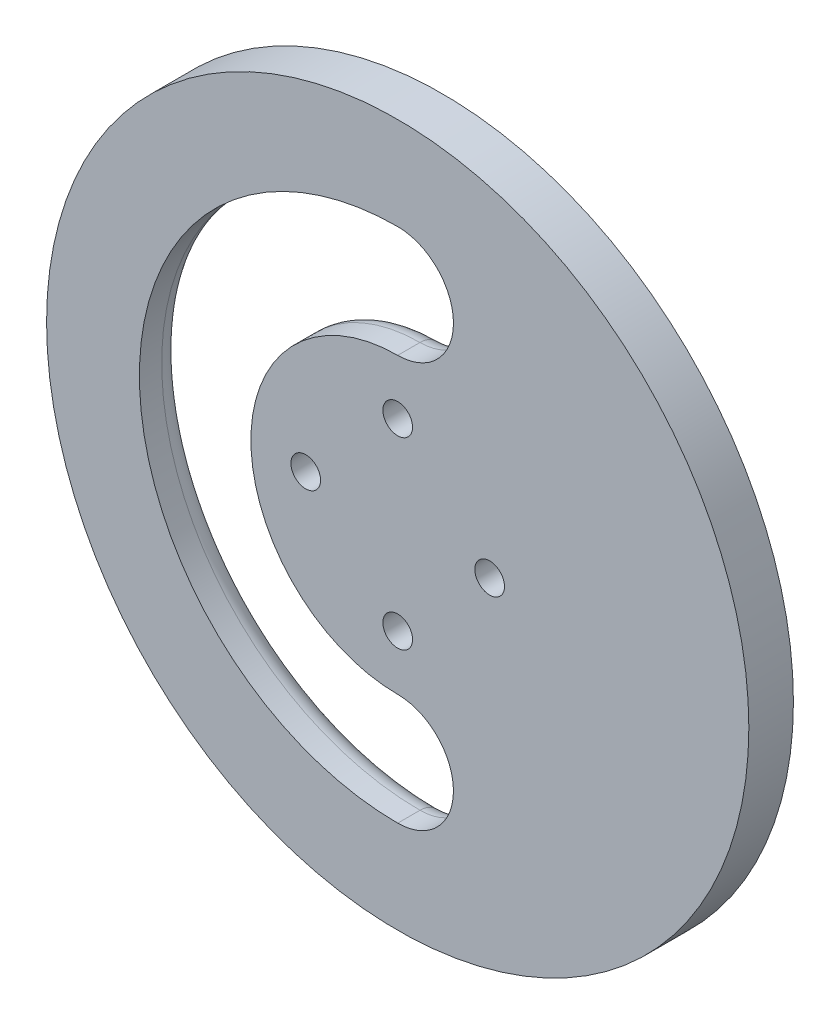
ISO-10303-21;
HEADER;
FILE_DESCRIPTION(('STEP AP214'),'2;1');
FILE_NAME('part.step','',(''),(''),'','','');
FILE_SCHEMA(('AUTOMOTIVE_DESIGN { 1 0 10303 214 1 1 1 1 }'));
ENDSEC;
DATA;
#1=APPLICATION_CONTEXT('core data for automotive mechanical design processes');
#2=APPLICATION_PROTOCOL_DEFINITION('international standard','automotive_design',2000,#1);
#3=PRODUCT_CONTEXT('',#1,'mechanical');
#4=PRODUCT('Part','Part','',(#3));
#5=PRODUCT_RELATED_PRODUCT_CATEGORY('part','',(#4));
#6=PRODUCT_DEFINITION_FORMATION('','',#4);
#7=PRODUCT_DEFINITION_CONTEXT('part definition',#1,'design');
#8=PRODUCT_DEFINITION('design','',#6,#7);
#9=PRODUCT_DEFINITION_SHAPE('','',#8);
#10=(LENGTH_UNIT() NAMED_UNIT(*) SI_UNIT(.MILLI.,.METRE.));
#11=(NAMED_UNIT(*) PLANE_ANGLE_UNIT() SI_UNIT($,.RADIAN.));
#12=(NAMED_UNIT(*) SI_UNIT($,.STERADIAN.) SOLID_ANGLE_UNIT());
#13=UNCERTAINTY_MEASURE_WITH_UNIT(LENGTH_MEASURE(1.E-05),#10,'distance_accuracy_value','');
#14=(GEOMETRIC_REPRESENTATION_CONTEXT(3) GLOBAL_UNCERTAINTY_ASSIGNED_CONTEXT((#13)) GLOBAL_UNIT_ASSIGNED_CONTEXT((#10,
#11,#12)) REPRESENTATION_CONTEXT('',''));
#15=CARTESIAN_POINT('',(0.,0.,0.));
#16=DIRECTION('',(0.,0.,1.));
#17=DIRECTION('',(1.,0.,0.));
#18=AXIS2_PLACEMENT_3D('',#15,#16,#17);
#19=CARTESIAN_POINT('',(0.,0.,4.));
#20=DIRECTION('',(0.,0.,-1.));
#21=DIRECTION('',(-1.,0.,0.));
#22=AXIS2_PLACEMENT_3D('',#19,#20,#21);
#23=CYLINDRICAL_SURFACE('',#22,31.5);
#24=CARTESIAN_POINT('',(0.,0.,4.));
#25=DIRECTION('',(0.,0.,1.));
#26=DIRECTION('',(1.,0.,0.));
#27=AXIS2_PLACEMENT_3D('',#24,#25,#26);
#28=CIRCLE('',#27,31.5);
#29=CARTESIAN_POINT('',(31.5,0.,4.));
#30=VERTEX_POINT('',#29);
#31=EDGE_CURVE('E207',#30,#30,#28,.T.);
#32=ORIENTED_EDGE('',*,*,#31,.F.);
#33=EDGE_LOOP('',(#32));
#34=FACE_BOUND('',#33,.T.);
#35=CARTESIAN_POINT('',(0.,0.,0.));
#36=DIRECTION('',(0.,0.,1.));
#37=DIRECTION('',(1.,0.,0.));
#38=AXIS2_PLACEMENT_3D('',#35,#36,#37);
#39=CIRCLE('',#38,31.5);
#40=CARTESIAN_POINT('',(31.5,0.,0.));
#41=VERTEX_POINT('',#40);
#42=EDGE_CURVE('E186',#41,#41,#39,.T.);
#43=ORIENTED_EDGE('',*,*,#42,.T.);
#44=EDGE_LOOP('',(#43));
#45=FACE_BOUND('',#44,.T.);
#46=ADVANCED_FACE('F37',(#34,#45),#23,.T.);
#47=CARTESIAN_POINT('',(0.,0.,4.));
#48=DIRECTION('',(0.,0.,1.));
#49=DIRECTION('',(1.,0.,0.));
#50=AXIS2_PLACEMENT_3D('',#47,#48,#49);
#51=PLANE('',#50);
#52=CARTESIAN_POINT('',(0.,0.,4.));
#53=DIRECTION('',(0.,0.,1.));
#54=DIRECTION('',(1.,0.,0.));
#55=AXIS2_PLACEMENT_3D('',#52,#53,#54);
#56=CIRCLE('',#55,23.1723185156235);
#57=CARTESIAN_POINT('',(0.,23.1723185156235,4.));
#58=VERTEX_POINT('',#57);
#59=CARTESIAN_POINT('',(0.,-23.1723185156235,4.));
#60=VERTEX_POINT('',#59);
#61=EDGE_CURVE('E128',#58,#60,#56,.T.);
#62=ORIENTED_EDGE('',*,*,#61,.F.);
#63=CARTESIAN_POINT('',(0.,18.1711592578118,4.));
#64=DIRECTION('',(0.,0.,1.));
#65=DIRECTION('',(1.,0.,0.));
#66=AXIS2_PLACEMENT_3D('',#63,#64,#65);
#67=CIRCLE('',#66,5.00115925781177);
#68=CARTESIAN_POINT('',(0.,13.17,4.));
#69=VERTEX_POINT('',#68);
#70=EDGE_CURVE('E133',#69,#58,#67,.T.);
#71=ORIENTED_EDGE('',*,*,#70,.F.);
#72=CARTESIAN_POINT('',(0.,0.,4.));
#73=DIRECTION('',(0.,0.,-1.));
#74=DIRECTION('',(1.,0.,0.));
#75=AXIS2_PLACEMENT_3D('',#72,#73,#74);
#76=CIRCLE('',#75,13.17);
#77=CARTESIAN_POINT('',(0.,-13.17,4.));
#78=VERTEX_POINT('',#77);
#79=EDGE_CURVE('E117',#78,#69,#76,.T.);
#80=ORIENTED_EDGE('',*,*,#79,.F.);
#81=CARTESIAN_POINT('',(0.,-18.1711592578118,4.));
#82=DIRECTION('',(0.,0.,1.));
#83=DIRECTION('',(1.,0.,0.));
#84=AXIS2_PLACEMENT_3D('',#81,#82,#83);
#85=CIRCLE('',#84,5.00115925781177);
#86=EDGE_CURVE('E123',#60,#78,#85,.T.);
#87=ORIENTED_EDGE('',*,*,#86,.F.);
#88=EDGE_LOOP('',(#62,#71,#80,#87));
#89=FACE_BOUND('',#88,.T.);
#90=CARTESIAN_POINT('',(0.,8.25,4.));
#91=DIRECTION('',(0.,0.,-1.));
#92=DIRECTION('',(-1.,0.,0.));
#93=AXIS2_PLACEMENT_3D('',#90,#91,#92);
#94=CIRCLE('',#93,1.33);
#95=CARTESIAN_POINT('',(-1.33,8.25,4.));
#96=VERTEX_POINT('',#95);
#97=EDGE_CURVE('E183',#96,#96,#94,.T.);
#98=ORIENTED_EDGE('',*,*,#97,.T.);
#99=EDGE_LOOP('',(#98));
#100=FACE_BOUND('',#99,.T.);
#101=CARTESIAN_POINT('',(-8.25000000000023,2.32963602386888E-13,4.));
#102=DIRECTION('',(0.,0.,-1.));
#103=DIRECTION('',(-1.,0.,0.));
#104=AXIS2_PLACEMENT_3D('',#101,#102,#103);
#105=CIRCLE('',#104,1.33000000000018);
#106=CARTESIAN_POINT('',(-9.58000000000042,2.32963602386888E-13,4.));
#107=VERTEX_POINT('',#106);
#108=EDGE_CURVE('E190',#107,#107,#105,.T.);
#109=ORIENTED_EDGE('',*,*,#108,.T.);
#110=EDGE_LOOP('',(#109));
#111=FACE_BOUND('',#110,.T.);
#112=CARTESIAN_POINT('',(-4.67285447674905E-13,-8.25,4.));
#113=DIRECTION('',(0.,0.,-1.));
#114=DIRECTION('',(-1.,0.,0.));
#115=AXIS2_PLACEMENT_3D('',#112,#113,#114);
#116=CIRCLE('',#115,1.3300000000005);
#117=CARTESIAN_POINT('',(-1.33000000000097,-8.25,4.));
#118=VERTEX_POINT('',#117);
#119=EDGE_CURVE('E196',#118,#118,#116,.T.);
#120=ORIENTED_EDGE('',*,*,#119,.T.);
#121=EDGE_LOOP('',(#120));
#122=FACE_BOUND('',#121,.T.);
#123=CARTESIAN_POINT('',(8.24999999999977,-2.33973935996185E-13,4.));
#124=DIRECTION('',(0.,0.,-1.));
#125=DIRECTION('',(-1.,0.,0.));
#126=AXIS2_PLACEMENT_3D('',#123,#124,#125);
#127=CIRCLE('',#126,1.33000000000038);
#128=CARTESIAN_POINT('',(6.91999999999939,-2.33973935996185E-13,4.));
#129=VERTEX_POINT('',#128);
#130=EDGE_CURVE('E202',#129,#129,#127,.T.);
#131=ORIENTED_EDGE('',*,*,#130,.T.);
#132=EDGE_LOOP('',(#131));
#133=FACE_BOUND('',#132,.T.);
#134=ORIENTED_EDGE('',*,*,#31,.T.);
#135=EDGE_LOOP('',(#134));
#136=FACE_BOUND('',#135,.T.);
#137=ADVANCED_FACE('F130',(#89,#100,#111,#122,#133,#136),#51,.T.);
#138=CARTESIAN_POINT('',(0.,0.,0.));
#139=DIRECTION('',(0.,0.,1.));
#140=DIRECTION('',(1.,0.,0.));
#141=AXIS2_PLACEMENT_3D('',#138,#139,#140);
#142=PLANE('',#141);
#143=CARTESIAN_POINT('',(0.,0.,0.));
#144=DIRECTION('',(0.,0.,1.));
#145=DIRECTION('',(1.,0.,0.));
#146=AXIS2_PLACEMENT_3D('',#143,#144,#145);
#147=CIRCLE('',#146,11.17);
#148=CARTESIAN_POINT('',(0.,-11.17,0.));
#149=VERTEX_POINT('',#148);
#150=CARTESIAN_POINT('',(0.,11.17,0.));
#151=VERTEX_POINT('',#150);
#152=EDGE_CURVE('E220',#149,#151,#147,.F.);
#153=ORIENTED_EDGE('',*,*,#152,.T.);
#154=CARTESIAN_POINT('',(0.,18.1711592578118,0.));
#155=DIRECTION('',(0.,0.,1.));
#156=DIRECTION('',(1.,0.,0.));
#157=AXIS2_PLACEMENT_3D('',#154,#155,#156);
#158=CIRCLE('',#157,7.00115925781177);
#159=CARTESIAN_POINT('',(0.0719686641468573,25.1719486036373,0.));
#160=VERTEX_POINT('',#159);
#161=EDGE_CURVE('E222',#151,#160,#158,.T.);
#162=ORIENTED_EDGE('',*,*,#161,.T.);
#163=CARTESIAN_POINT('',(0.,26.5,0.));
#164=DIRECTION('',(0.,0.,-1.));
#165=DIRECTION('',(-1.,0.,0.));
#166=AXIS2_PLACEMENT_3D('',#163,#164,#165);
#167=CIRCLE('',#166,1.33);
#168=CARTESIAN_POINT('',(-0.0765058508639856,25.1722022538114,0.));
#169=VERTEX_POINT('',#168);
#170=EDGE_CURVE('E150',#169,#160,#167,.T.);
#171=ORIENTED_EDGE('',*,*,#170,.F.);
#172=CARTESIAN_POINT('',(0.,0.,0.));
#173=DIRECTION('',(0.,0.,1.));
#174=DIRECTION('',(1.,0.,0.));
#175=AXIS2_PLACEMENT_3D('',#172,#173,#174);
#176=CIRCLE('',#175,25.1723185156235);
#177=CARTESIAN_POINT('',(-21.7615136955756,12.6523571372799,0.));
#178=VERTEX_POINT('',#177);
#179=EDGE_CURVE('E216',#169,#178,#176,.T.);
#180=ORIENTED_EDGE('',*,*,#179,.T.);
#181=CARTESIAN_POINT('',(-22.9496732002884,13.2500000000013,0.));
#182=DIRECTION('',(0.,0.,-1.));
#183=DIRECTION('',(-1.,0.,0.));
#184=AXIS2_PLACEMENT_3D('',#181,#182,#183);
#185=CIRCLE('',#184,1.33000000000041);
#186=CARTESIAN_POINT('',(-21.8380195464248,12.5198451165328,0.));
#187=VERTEX_POINT('',#186);
#188=EDGE_CURVE('E163',#187,#178,#185,.T.);
#189=ORIENTED_EDGE('',*,*,#188,.F.);
#190=CARTESIAN_POINT('',(0.,0.,0.));
#191=DIRECTION('',(0.,0.,1.));
#192=DIRECTION('',(1.,0.,0.));
#193=AXIS2_PLACEMENT_3D('',#190,#191,#192);
#194=CIRCLE('',#193,25.1723185156235);
#195=CARTESIAN_POINT('',(-21.8380195464386,-12.5198451165088,0.));
#196=VERTEX_POINT('',#195);
#197=EDGE_CURVE('E214',#187,#196,#194,.T.);
#198=ORIENTED_EDGE('',*,*,#197,.T.);
#199=CARTESIAN_POINT('',(-22.9496732002899,-13.2499999999987,0.));
#200=DIRECTION('',(0.,0.,-1.));
#201=DIRECTION('',(-1.,0.,0.));
#202=AXIS2_PLACEMENT_3D('',#199,#200,#201);
#203=CIRCLE('',#202,1.3300000000019);
#204=CARTESIAN_POINT('',(-21.7615136955646,-12.6523571372988,0.));
#205=VERTEX_POINT('',#204);
#206=EDGE_CURVE('E170',#205,#196,#203,.T.);
#207=ORIENTED_EDGE('',*,*,#206,.F.);
#208=CARTESIAN_POINT('',(0.,0.,0.));
#209=DIRECTION('',(0.,0.,1.));
#210=DIRECTION('',(1.,0.,0.));
#211=AXIS2_PLACEMENT_3D('',#208,#209,#210);
#212=CIRCLE('',#211,25.1723185156235);
#213=CARTESIAN_POINT('',(-0.0765058509171791,-25.1722022538112,0.));
#214=VERTEX_POINT('',#213);
#215=EDGE_CURVE('E210',#205,#214,#212,.T.);
#216=ORIENTED_EDGE('',*,*,#215,.T.);
#217=CARTESIAN_POINT('',(-3.0029652575696E-12,-26.5,0.));
#218=DIRECTION('',(0.,0.,-1.));
#219=DIRECTION('',(-1.,0.,0.));
#220=AXIS2_PLACEMENT_3D('',#217,#218,#219);
#221=CIRCLE('',#220,1.33000000000305);
#222=CARTESIAN_POINT('',(0.0719686641916683,-25.1719486036368,0.));
#223=VERTEX_POINT('',#222);
#224=EDGE_CURVE('E177',#223,#214,#221,.T.);
#225=ORIENTED_EDGE('',*,*,#224,.F.);
#226=CARTESIAN_POINT('',(0.,-18.1711592578118,0.));
#227=DIRECTION('',(0.,0.,1.));
#228=DIRECTION('',(1.,0.,0.));
#229=AXIS2_PLACEMENT_3D('',#226,#227,#228);
#230=CIRCLE('',#229,7.00115925781177);
#231=EDGE_CURVE('E218',#223,#149,#230,.T.);
#232=ORIENTED_EDGE('',*,*,#231,.T.);
#233=EDGE_LOOP('',(#153,#162,#171,#180,#189,#198,#207,#216,#225,#232));
#234=FACE_BOUND('',#233,.T.);
#235=CARTESIAN_POINT('',(22.9496732002869,13.2499999999987,0.));
#236=DIRECTION('',(0.,0.,-1.));
#237=DIRECTION('',(-1.,0.,0.));
#238=AXIS2_PLACEMENT_3D('',#235,#236,#237);
#239=CIRCLE('',#238,1.33000000000142);
#240=CARTESIAN_POINT('',(21.6196732002855,13.2499999999987,0.));
#241=VERTEX_POINT('',#240);
#242=EDGE_CURVE('E140',#241,#241,#239,.T.);
#243=ORIENTED_EDGE('',*,*,#242,.F.);
#244=EDGE_LOOP('',(#243));
#245=FACE_BOUND('',#244,.T.);
#246=CARTESIAN_POINT('',(22.9496732002854,-13.2500000000013,0.));
#247=DIRECTION('',(0.,0.,-1.));
#248=DIRECTION('',(-1.,0.,0.));
#249=AXIS2_PLACEMENT_3D('',#246,#247,#248);
#250=CIRCLE('',#249,1.33000000000277);
#251=CARTESIAN_POINT('',(21.6196732002826,-13.2500000000013,0.));
#252=VERTEX_POINT('',#251);
#253=EDGE_CURVE('E154',#252,#252,#250,.T.);
#254=ORIENTED_EDGE('',*,*,#253,.F.);
#255=EDGE_LOOP('',(#254));
#256=FACE_BOUND('',#255,.T.);
#257=CARTESIAN_POINT('',(0.,8.25,0.));
#258=DIRECTION('',(0.,0.,-1.));
#259=DIRECTION('',(-1.,0.,0.));
#260=AXIS2_PLACEMENT_3D('',#257,#258,#259);
#261=CIRCLE('',#260,1.33);
#262=CARTESIAN_POINT('',(-1.33,8.25,0.));
#263=VERTEX_POINT('',#262);
#264=EDGE_CURVE('E187',#263,#263,#261,.T.);
#265=ORIENTED_EDGE('',*,*,#264,.F.);
#266=EDGE_LOOP('',(#265));
#267=FACE_BOUND('',#266,.T.);
#268=CARTESIAN_POINT('',(-8.25000000000023,2.32963602386888E-13,0.));
#269=DIRECTION('',(0.,0.,-1.));
#270=DIRECTION('',(-1.,0.,0.));
#271=AXIS2_PLACEMENT_3D('',#268,#269,#270);
#272=CIRCLE('',#271,1.33000000000018);
#273=CARTESIAN_POINT('',(-9.58000000000042,2.32963602386888E-13,0.));
#274=VERTEX_POINT('',#273);
#275=EDGE_CURVE('E193',#274,#274,#272,.T.);
#276=ORIENTED_EDGE('',*,*,#275,.F.);
#277=EDGE_LOOP('',(#276));
#278=FACE_BOUND('',#277,.T.);
#279=CARTESIAN_POINT('',(-4.67285447674905E-13,-8.25,0.));
#280=DIRECTION('',(0.,0.,-1.));
#281=DIRECTION('',(-1.,0.,0.));
#282=AXIS2_PLACEMENT_3D('',#279,#280,#281);
#283=CIRCLE('',#282,1.3300000000005);
#284=CARTESIAN_POINT('',(-1.33000000000097,-8.25,0.));
#285=VERTEX_POINT('',#284);
#286=EDGE_CURVE('E199',#285,#285,#283,.T.);
#287=ORIENTED_EDGE('',*,*,#286,.F.);
#288=EDGE_LOOP('',(#287));
#289=FACE_BOUND('',#288,.T.);
#290=CARTESIAN_POINT('',(8.24999999999977,-2.33973935996185E-13,0.));
#291=DIRECTION('',(0.,0.,-1.));
#292=DIRECTION('',(-1.,0.,0.));
#293=AXIS2_PLACEMENT_3D('',#290,#291,#292);
#294=CIRCLE('',#293,1.33000000000038);
#295=CARTESIAN_POINT('',(6.91999999999939,-2.33973935996185E-13,0.));
#296=VERTEX_POINT('',#295);
#297=EDGE_CURVE('E146',#296,#296,#294,.T.);
#298=ORIENTED_EDGE('',*,*,#297,.F.);
#299=EDGE_LOOP('',(#298));
#300=FACE_BOUND('',#299,.T.);
#301=ORIENTED_EDGE('',*,*,#42,.F.);
#302=EDGE_LOOP('',(#301));
#303=FACE_BOUND('',#302,.T.);
#304=ADVANCED_FACE('F264',(#234,#245,#256,#267,#278,#289,#300,#303),#142,.F.);
#305=CARTESIAN_POINT('',(8.24999999999977,-2.33973935996185E-13,4.));
#306=DIRECTION('',(0.,0.,-1.));
#307=DIRECTION('',(-1.,0.,0.));
#308=AXIS2_PLACEMENT_3D('',#305,#306,#307);
#309=CYLINDRICAL_SURFACE('',#308,1.33000000000038);
#310=ORIENTED_EDGE('',*,*,#130,.F.);
#311=EDGE_LOOP('',(#310));
#312=FACE_BOUND('',#311,.T.);
#313=ORIENTED_EDGE('',*,*,#297,.T.);
#314=EDGE_LOOP('',(#313));
#315=FACE_BOUND('',#314,.T.);
#316=ADVANCED_FACE('F402',(#312,#315),#309,.F.);
#317=CARTESIAN_POINT('',(-4.67285447674905E-13,-8.25,4.));
#318=DIRECTION('',(0.,0.,-1.));
#319=DIRECTION('',(-1.,0.,0.));
#320=AXIS2_PLACEMENT_3D('',#317,#318,#319);
#321=CYLINDRICAL_SURFACE('',#320,1.3300000000005);
#322=ORIENTED_EDGE('',*,*,#119,.F.);
#323=EDGE_LOOP('',(#322));
#324=FACE_BOUND('',#323,.T.);
#325=ORIENTED_EDGE('',*,*,#286,.T.);
#326=EDGE_LOOP('',(#325));
#327=FACE_BOUND('',#326,.T.);
#328=ADVANCED_FACE('F492',(#324,#327),#321,.F.);
#329=CARTESIAN_POINT('',(-8.25000000000023,2.32963602386888E-13,4.));
#330=DIRECTION('',(0.,0.,-1.));
#331=DIRECTION('',(-1.,0.,0.));
#332=AXIS2_PLACEMENT_3D('',#329,#330,#331);
#333=CYLINDRICAL_SURFACE('',#332,1.33000000000018);
#334=ORIENTED_EDGE('',*,*,#108,.F.);
#335=EDGE_LOOP('',(#334));
#336=FACE_BOUND('',#335,.T.);
#337=ORIENTED_EDGE('',*,*,#275,.T.);
#338=EDGE_LOOP('',(#337));
#339=FACE_BOUND('',#338,.T.);
#340=ADVANCED_FACE('F482',(#336,#339),#333,.F.);
#341=CARTESIAN_POINT('',(0.,8.25,4.));
#342=DIRECTION('',(0.,0.,-1.));
#343=DIRECTION('',(-1.,0.,0.));
#344=AXIS2_PLACEMENT_3D('',#341,#342,#343);
#345=CYLINDRICAL_SURFACE('',#344,1.33);
#346=ORIENTED_EDGE('',*,*,#97,.F.);
#347=EDGE_LOOP('',(#346));
#348=FACE_BOUND('',#347,.T.);
#349=ORIENTED_EDGE('',*,*,#264,.T.);
#350=EDGE_LOOP('',(#349));
#351=FACE_BOUND('',#350,.T.);
#352=ADVANCED_FACE('F390',(#348,#351),#345,.F.);
#353=CARTESIAN_POINT('',(-22.9496732002884,13.2500000000013,3.));
#354=DIRECTION('',(0.,0.,-1.));
#355=DIRECTION('',(-1.,0.,0.));
#356=AXIS2_PLACEMENT_3D('',#353,#354,#355);
#357=CYLINDRICAL_SURFACE('',#356,1.33000000000041);
#358=CARTESIAN_POINT('',(-22.9496732002884,13.2500000000013,3.));
#359=DIRECTION('',(0.,0.,-1.));
#360=DIRECTION('',(-1.,0.,0.));
#361=AXIS2_PLACEMENT_3D('',#358,#359,#360);
#362=CIRCLE('',#361,1.33000000000041);
#363=CARTESIAN_POINT('',(-24.2796732002888,13.2500000000013,3.));
#364=VERTEX_POINT('',#363);
#365=EDGE_CURVE('E157',#364,#364,#362,.T.);
#366=ORIENTED_EDGE('',*,*,#365,.F.);
#367=EDGE_LOOP('',(#366));
#368=FACE_BOUND('',#367,.T.);
#369=EDGE_CURVE('E160',#178,#187,#185,.T.);
#370=ORIENTED_EDGE('',*,*,#369,.T.);
#371=ORIENTED_EDGE('',*,*,#188,.T.);
#372=EDGE_LOOP('',(#370,#371));
#373=FACE_BOUND('',#372,.T.);
#374=ADVANCED_FACE('F385',(#368,#373),#357,.F.);
#375=CARTESIAN_POINT('',(-22.9496732002884,13.2500000000013,3.));
#376=DIRECTION('',(0.,0.,-1.));
#377=DIRECTION('',(-1.,0.,0.));
#378=AXIS2_PLACEMENT_3D('',#375,#376,#377);
#379=PLANE('',#378);
#380=ORIENTED_EDGE('',*,*,#365,.T.);
#381=EDGE_LOOP('',(#380));
#382=FACE_BOUND('',#381,.T.);
#383=ADVANCED_FACE('F377',(#382),#379,.T.);
#384=CARTESIAN_POINT('',(-22.9496732002899,-13.2499999999987,3.));
#385=DIRECTION('',(0.,0.,-1.));
#386=DIRECTION('',(-1.,0.,0.));
#387=AXIS2_PLACEMENT_3D('',#384,#385,#386);
#388=CYLINDRICAL_SURFACE('',#387,1.3300000000019);
#389=CARTESIAN_POINT('',(-22.9496732002899,-13.2499999999987,3.));
#390=DIRECTION('',(0.,0.,-1.));
#391=DIRECTION('',(-1.,0.,0.));
#392=AXIS2_PLACEMENT_3D('',#389,#390,#391);
#393=CIRCLE('',#392,1.3300000000019);
#394=CARTESIAN_POINT('',(-24.2796732002918,-13.2499999999987,3.));
#395=VERTEX_POINT('',#394);
#396=EDGE_CURVE('E164',#395,#395,#393,.T.);
#397=ORIENTED_EDGE('',*,*,#396,.F.);
#398=EDGE_LOOP('',(#397));
#399=FACE_BOUND('',#398,.T.);
#400=EDGE_CURVE('E167',#196,#205,#203,.T.);
#401=ORIENTED_EDGE('',*,*,#400,.T.);
#402=ORIENTED_EDGE('',*,*,#206,.T.);
#403=EDGE_LOOP('',(#401,#402));
#404=FACE_BOUND('',#403,.T.);
#405=ADVANCED_FACE('F372',(#399,#404),#388,.F.);
#406=CARTESIAN_POINT('',(-22.9496732002899,-13.2499999999987,3.));
#407=DIRECTION('',(0.,0.,-1.));
#408=DIRECTION('',(-1.,0.,0.));
#409=AXIS2_PLACEMENT_3D('',#406,#407,#408);
#410=PLANE('',#409);
#411=ORIENTED_EDGE('',*,*,#396,.T.);
#412=EDGE_LOOP('',(#411));
#413=FACE_BOUND('',#412,.T.);
#414=ADVANCED_FACE('F362',(#413),#410,.T.);
#415=CARTESIAN_POINT('',(-3.0029652575696E-12,-26.5,3.));
#416=DIRECTION('',(0.,0.,-1.));
#417=DIRECTION('',(-1.,0.,0.));
#418=AXIS2_PLACEMENT_3D('',#415,#416,#417);
#419=CYLINDRICAL_SURFACE('',#418,1.33000000000305);
#420=CARTESIAN_POINT('',(-3.0029652575696E-12,-26.5,3.));
#421=DIRECTION('',(0.,0.,-1.));
#422=DIRECTION('',(-1.,0.,0.));
#423=AXIS2_PLACEMENT_3D('',#420,#421,#422);
#424=CIRCLE('',#423,1.33000000000305);
#425=CARTESIAN_POINT('',(-1.33000000000605,-26.5,3.));
#426=VERTEX_POINT('',#425);
#427=EDGE_CURVE('E171',#426,#426,#424,.T.);
#428=ORIENTED_EDGE('',*,*,#427,.F.);
#429=EDGE_LOOP('',(#428));
#430=FACE_BOUND('',#429,.T.);
#431=CARTESIAN_POINT('',(0.,-25.169999999997,0.));
#432=VERTEX_POINT('',#431);
#433=EDGE_CURVE('E174',#214,#432,#221,.T.);
#434=ORIENTED_EDGE('',*,*,#433,.T.);
#435=EDGE_CURVE('E176',#432,#223,#221,.T.);
#436=ORIENTED_EDGE('',*,*,#435,.T.);
#437=ORIENTED_EDGE('',*,*,#224,.T.);
#438=EDGE_LOOP('',(#434,#436,#437));
#439=FACE_BOUND('',#438,.T.);
#440=ADVANCED_FACE('F356',(#430,#439),#419,.F.);
#441=CARTESIAN_POINT('',(-3.0029652575696E-12,-26.5,3.));
#442=DIRECTION('',(0.,0.,-1.));
#443=DIRECTION('',(-1.,0.,0.));
#444=AXIS2_PLACEMENT_3D('',#441,#442,#443);
#445=PLANE('',#444);
#446=ORIENTED_EDGE('',*,*,#427,.T.);
#447=EDGE_LOOP('',(#446));
#448=FACE_BOUND('',#447,.T.);
#449=ADVANCED_FACE('F361',(#448),#445,.T.);
#450=CARTESIAN_POINT('',(22.9496732002854,-13.2500000000013,3.));
#451=DIRECTION('',(0.,0.,-1.));
#452=DIRECTION('',(-1.,0.,0.));
#453=AXIS2_PLACEMENT_3D('',#450,#451,#452);
#454=CYLINDRICAL_SURFACE('',#453,1.33000000000277);
#455=CARTESIAN_POINT('',(22.9496732002854,-13.2500000000013,3.));
#456=DIRECTION('',(0.,0.,-1.));
#457=DIRECTION('',(-1.,0.,0.));
#458=AXIS2_PLACEMENT_3D('',#455,#456,#457);
#459=CIRCLE('',#458,1.33000000000277);
#460=CARTESIAN_POINT('',(21.6196732002826,-13.2500000000013,3.));
#461=VERTEX_POINT('',#460);
#462=EDGE_CURVE('E178',#461,#461,#459,.T.);
#463=ORIENTED_EDGE('',*,*,#462,.F.);
#464=EDGE_LOOP('',(#463));
#465=FACE_BOUND('',#464,.T.);
#466=ORIENTED_EDGE('',*,*,#253,.T.);
#467=EDGE_LOOP('',(#466));
#468=FACE_BOUND('',#467,.T.);
#469=ADVANCED_FACE('F444',(#465,#468),#454,.F.);
#470=CARTESIAN_POINT('',(22.9496732002854,-13.2500000000013,3.));
#471=DIRECTION('',(0.,0.,-1.));
#472=DIRECTION('',(-1.,0.,0.));
#473=AXIS2_PLACEMENT_3D('',#470,#471,#472);
#474=PLANE('',#473);
#475=ORIENTED_EDGE('',*,*,#462,.T.);
#476=EDGE_LOOP('',(#475));
#477=FACE_BOUND('',#476,.T.);
#478=ADVANCED_FACE('F434',(#477),#474,.T.);
#479=CARTESIAN_POINT('',(22.9496732002869,13.2499999999987,3.));
#480=DIRECTION('',(0.,0.,-1.));
#481=DIRECTION('',(-1.,0.,0.));
#482=AXIS2_PLACEMENT_3D('',#479,#480,#481);
#483=CYLINDRICAL_SURFACE('',#482,1.33000000000142);
#484=CARTESIAN_POINT('',(22.9496732002869,13.2499999999987,3.));
#485=DIRECTION('',(0.,0.,-1.));
#486=DIRECTION('',(-1.,0.,0.));
#487=AXIS2_PLACEMENT_3D('',#484,#485,#486);
#488=CIRCLE('',#487,1.33000000000142);
#489=CARTESIAN_POINT('',(21.6196732002855,13.2499999999987,3.));
#490=VERTEX_POINT('',#489);
#491=EDGE_CURVE('E151',#490,#490,#488,.T.);
#492=ORIENTED_EDGE('',*,*,#491,.F.);
#493=EDGE_LOOP('',(#492));
#494=FACE_BOUND('',#493,.T.);
#495=ORIENTED_EDGE('',*,*,#242,.T.);
#496=EDGE_LOOP('',(#495));
#497=FACE_BOUND('',#496,.T.);
#498=ADVANCED_FACE('F424',(#494,#497),#483,.F.);
#499=CARTESIAN_POINT('',(22.9496732002869,13.2499999999987,3.));
#500=DIRECTION('',(0.,0.,-1.));
#501=DIRECTION('',(-1.,0.,0.));
#502=AXIS2_PLACEMENT_3D('',#499,#500,#501);
#503=PLANE('',#502);
#504=ORIENTED_EDGE('',*,*,#491,.T.);
#505=EDGE_LOOP('',(#504));
#506=FACE_BOUND('',#505,.T.);
#507=ADVANCED_FACE('F348',(#506),#503,.T.);
#508=CARTESIAN_POINT('',(0.,26.5,3.));
#509=DIRECTION('',(0.,0.,-1.));
#510=DIRECTION('',(-1.,0.,0.));
#511=AXIS2_PLACEMENT_3D('',#508,#509,#510);
#512=CYLINDRICAL_SURFACE('',#511,1.33);
#513=CARTESIAN_POINT('',(0.,26.5,3.));
#514=DIRECTION('',(0.,0.,-1.));
#515=DIRECTION('',(-1.,0.,0.));
#516=AXIS2_PLACEMENT_3D('',#513,#514,#515);
#517=CIRCLE('',#516,1.33);
#518=CARTESIAN_POINT('',(-1.33,26.5,3.));
#519=VERTEX_POINT('',#518);
#520=EDGE_CURVE('E143',#519,#519,#517,.T.);
#521=ORIENTED_EDGE('',*,*,#520,.F.);
#522=EDGE_LOOP('',(#521));
#523=FACE_BOUND('',#522,.T.);
#524=CARTESIAN_POINT('',(0.,25.17,0.));
#525=VERTEX_POINT('',#524);
#526=EDGE_CURVE('E147',#160,#525,#167,.T.);
#527=ORIENTED_EDGE('',*,*,#526,.T.);
#528=EDGE_CURVE('E149',#525,#169,#167,.T.);
#529=ORIENTED_EDGE('',*,*,#528,.T.);
#530=ORIENTED_EDGE('',*,*,#170,.T.);
#531=EDGE_LOOP('',(#527,#529,#530));
#532=FACE_BOUND('',#531,.T.);
#533=ADVANCED_FACE('F262',(#523,#532),#512,.F.);
#534=CARTESIAN_POINT('',(0.,26.5,3.));
#535=DIRECTION('',(0.,0.,-1.));
#536=DIRECTION('',(-1.,0.,0.));
#537=AXIS2_PLACEMENT_3D('',#534,#535,#536);
#538=PLANE('',#537);
#539=ORIENTED_EDGE('',*,*,#520,.T.);
#540=EDGE_LOOP('',(#539));
#541=FACE_BOUND('',#540,.T.);
#542=ADVANCED_FACE('F337',(#541),#538,.T.);
#543=CARTESIAN_POINT('',(0.,0.,0.));
#544=DIRECTION('',(0.,0.,1.));
#545=DIRECTION('',(1.,0.,0.));
#546=AXIS2_PLACEMENT_3D('',#543,#544,#545);
#547=CYLINDRICAL_SURFACE('',#546,23.1723185156235);
#548=DIRECTION('',(0.,0.,1.));
#549=VECTOR('',#548,1.);
#550=CARTESIAN_POINT('',(0.,-23.1723185156235,0.));
#551=LINE('',#550,#549);
#552=CARTESIAN_POINT('',(0.,-23.1723185156235,2.));
#553=VERTEX_POINT('',#552);
#554=EDGE_CURVE('E120',#553,#60,#551,.T.);
#555=ORIENTED_EDGE('',*,*,#554,.F.);
#556=CARTESIAN_POINT('',(0.,0.,2.));
#557=DIRECTION('',(0.,0.,1.));
#558=DIRECTION('',(1.,0.,0.));
#559=AXIS2_PLACEMENT_3D('',#556,#557,#558);
#560=CIRCLE('',#559,23.1723185156235);
#561=CARTESIAN_POINT('',(0.,23.1723185156235,2.));
#562=VERTEX_POINT('',#561);
#563=EDGE_CURVE('E11',#553,#562,#560,.F.);
#564=ORIENTED_EDGE('',*,*,#563,.T.);
#565=DIRECTION('',(0.,0.,1.));
#566=VECTOR('',#565,1.);
#567=CARTESIAN_POINT('',(0.,23.1723185156235,0.));
#568=LINE('',#567,#566);
#569=EDGE_CURVE('E138',#562,#58,#568,.T.);
#570=ORIENTED_EDGE('',*,*,#569,.T.);
#571=ORIENTED_EDGE('',*,*,#61,.T.);
#572=EDGE_LOOP('',(#555,#564,#570,#571));
#573=FACE_BOUND('',#572,.T.);
#574=ADVANCED_FACE('F245',(#573),#547,.F.);
#575=CARTESIAN_POINT('',(0.,18.1711592578118,0.));
#576=DIRECTION('',(0.,0.,1.));
#577=DIRECTION('',(1.,0.,0.));
#578=AXIS2_PLACEMENT_3D('',#575,#576,#577);
#579=CYLINDRICAL_SURFACE('',#578,5.00115925781177);
#580=ORIENTED_EDGE('',*,*,#569,.F.);
#581=CARTESIAN_POINT('',(0.,18.1711592578118,2.));
#582=DIRECTION('',(0.,0.,1.));
#583=DIRECTION('',(1.,0.,0.));
#584=AXIS2_PLACEMENT_3D('',#581,#582,#583);
#585=CIRCLE('',#584,5.00115925781177);
#586=CARTESIAN_POINT('',(0.,13.17,2.));
#587=VERTEX_POINT('',#586);
#588=EDGE_CURVE('E225',#562,#587,#585,.F.);
#589=ORIENTED_EDGE('',*,*,#588,.T.);
#590=DIRECTION('',(0.,0.,1.));
#591=VECTOR('',#590,1.);
#592=CARTESIAN_POINT('',(0.,13.17,0.));
#593=LINE('',#592,#591);
#594=EDGE_CURVE('E119',#587,#69,#593,.T.);
#595=ORIENTED_EDGE('',*,*,#594,.T.);
#596=ORIENTED_EDGE('',*,*,#70,.T.);
#597=EDGE_LOOP('',(#580,#589,#595,#596));
#598=FACE_BOUND('',#597,.T.);
#599=ADVANCED_FACE('F249',(#598),#579,.F.);
#600=CARTESIAN_POINT('',(0.,0.,0.));
#601=DIRECTION('',(0.,0.,1.));
#602=DIRECTION('',(1.,0.,0.));
#603=AXIS2_PLACEMENT_3D('',#600,#601,#602);
#604=CYLINDRICAL_SURFACE('',#603,13.17);
#605=ORIENTED_EDGE('',*,*,#594,.F.);
#606=CARTESIAN_POINT('',(0.,0.,2.));
#607=DIRECTION('',(0.,0.,1.));
#608=DIRECTION('',(1.,0.,0.));
#609=AXIS2_PLACEMENT_3D('',#606,#607,#608);
#610=CIRCLE('',#609,13.17);
#611=CARTESIAN_POINT('',(0.,-13.17,2.));
#612=VERTEX_POINT('',#611);
#613=EDGE_CURVE('E61',#587,#612,#610,.T.);
#614=ORIENTED_EDGE('',*,*,#613,.T.);
#615=DIRECTION('',(0.,0.,1.));
#616=VECTOR('',#615,1.);
#617=CARTESIAN_POINT('',(0.,-13.17,0.));
#618=LINE('',#617,#616);
#619=EDGE_CURVE('E113',#612,#78,#618,.T.);
#620=ORIENTED_EDGE('',*,*,#619,.T.);
#621=ORIENTED_EDGE('',*,*,#79,.T.);
#622=EDGE_LOOP('',(#605,#614,#620,#621));
#623=FACE_BOUND('',#622,.T.);
#624=ADVANCED_FACE('F115',(#623),#604,.T.);
#625=CARTESIAN_POINT('',(0.,-18.1711592578118,0.));
#626=DIRECTION('',(0.,0.,1.));
#627=DIRECTION('',(1.,0.,0.));
#628=AXIS2_PLACEMENT_3D('',#625,#626,#627);
#629=CYLINDRICAL_SURFACE('',#628,5.00115925781177);
#630=ORIENTED_EDGE('',*,*,#619,.F.);
#631=CARTESIAN_POINT('',(0.,-18.1711592578118,2.));
#632=DIRECTION('',(0.,0.,1.));
#633=DIRECTION('',(1.,0.,0.));
#634=AXIS2_PLACEMENT_3D('',#631,#632,#633);
#635=CIRCLE('',#634,5.00115925781177);
#636=EDGE_CURVE('E46',#612,#553,#635,.F.);
#637=ORIENTED_EDGE('',*,*,#636,.T.);
#638=ORIENTED_EDGE('',*,*,#554,.T.);
#639=ORIENTED_EDGE('',*,*,#86,.T.);
#640=EDGE_LOOP('',(#630,#637,#638,#639));
#641=FACE_BOUND('',#640,.T.);
#642=ADVANCED_FACE('F124',(#641),#629,.F.);
#643=CARTESIAN_POINT('',(0.,-18.1711592578118,2.));
#644=DIRECTION('',(0.,0.,1.));
#645=DIRECTION('',(1.,0.,0.));
#646=AXIS2_PLACEMENT_3D('',#643,#644,#645);
#647=TOROIDAL_SURFACE('',#646,7.00115925781177,2.);
#648=CARTESIAN_POINT('',(0.,-25.1723185156235,2.));
#649=DIRECTION('',(-1.,0.,0.));
#650=DIRECTION('',(0.,-1.,0.));
#651=AXIS2_PLACEMENT_3D('',#648,#649,#650);
#652=CIRCLE('',#651,2.);
#653=EDGE_CURVE('E234',#553,#432,#652,.T.);
#654=ORIENTED_EDGE('',*,*,#653,.F.);
#655=ORIENTED_EDGE('',*,*,#636,.F.);
#656=CARTESIAN_POINT('',(0.,-11.17,2.));
#657=DIRECTION('',(-1.,0.,0.));
#658=DIRECTION('',(0.,-1.,0.));
#659=AXIS2_PLACEMENT_3D('',#656,#657,#658);
#660=CIRCLE('',#659,2.);
#661=EDGE_CURVE('E41',#149,#612,#660,.T.);
#662=ORIENTED_EDGE('',*,*,#661,.F.);
#663=ORIENTED_EDGE('',*,*,#231,.F.);
#664=ORIENTED_EDGE('',*,*,#435,.F.);
#665=EDGE_LOOP('',(#654,#655,#662,#663,#664));
#666=FACE_BOUND('',#665,.T.);
#667=ADVANCED_FACE('F39',(#666),#647,.T.);
#668=CARTESIAN_POINT('',(0.,0.,2.));
#669=DIRECTION('',(0.,0.,1.));
#670=DIRECTION('',(1.,0.,0.));
#671=AXIS2_PLACEMENT_3D('',#668,#669,#670);
#672=TOROIDAL_SURFACE('',#671,11.17,2.);
#673=ORIENTED_EDGE('',*,*,#661,.T.);
#674=ORIENTED_EDGE('',*,*,#613,.F.);
#675=CARTESIAN_POINT('',(0.,11.17,2.));
#676=DIRECTION('',(1.,0.,0.));
#677=DIRECTION('',(0.,1.,0.));
#678=AXIS2_PLACEMENT_3D('',#675,#676,#677);
#679=CIRCLE('',#678,2.);
#680=EDGE_CURVE('E233',#151,#587,#679,.T.);
#681=ORIENTED_EDGE('',*,*,#680,.F.);
#682=ORIENTED_EDGE('',*,*,#152,.F.);
#683=EDGE_LOOP('',(#673,#674,#681,#682));
#684=FACE_BOUND('',#683,.T.);
#685=ADVANCED_FACE('F268',(#684),#672,.T.);
#686=CARTESIAN_POINT('',(0.,0.,2.));
#687=DIRECTION('',(0.,0.,1.));
#688=DIRECTION('',(1.,0.,0.));
#689=AXIS2_PLACEMENT_3D('',#686,#687,#688);
#690=TOROIDAL_SURFACE('',#689,25.1723185156235,2.);
#691=ORIENTED_EDGE('',*,*,#179,.F.);
#692=ORIENTED_EDGE('',*,*,#528,.F.);
#693=CARTESIAN_POINT('',(0.,25.1723185156235,2.));
#694=DIRECTION('',(1.,0.,0.));
#695=DIRECTION('',(0.,1.,0.));
#696=AXIS2_PLACEMENT_3D('',#693,#694,#695);
#697=CIRCLE('',#696,2.);
#698=EDGE_CURVE('E230',#562,#525,#697,.T.);
#699=ORIENTED_EDGE('',*,*,#698,.F.);
#700=ORIENTED_EDGE('',*,*,#563,.F.);
#701=ORIENTED_EDGE('',*,*,#653,.T.);
#702=ORIENTED_EDGE('',*,*,#433,.F.);
#703=ORIENTED_EDGE('',*,*,#215,.F.);
#704=ORIENTED_EDGE('',*,*,#400,.F.);
#705=ORIENTED_EDGE('',*,*,#197,.F.);
#706=ORIENTED_EDGE('',*,*,#369,.F.);
#707=EDGE_LOOP('',(#691,#692,#699,#700,#701,#702,#703,#704,#705,#706));
#708=FACE_BOUND('',#707,.T.);
#709=ADVANCED_FACE('F257',(#708),#690,.T.);
#710=CARTESIAN_POINT('',(0.,18.1711592578118,2.));
#711=DIRECTION('',(0.,0.,1.));
#712=DIRECTION('',(1.,0.,0.));
#713=AXIS2_PLACEMENT_3D('',#710,#711,#712);
#714=TOROIDAL_SURFACE('',#713,7.00115925781177,2.);
#715=ORIENTED_EDGE('',*,*,#680,.T.);
#716=ORIENTED_EDGE('',*,*,#588,.F.);
#717=ORIENTED_EDGE('',*,*,#698,.T.);
#718=ORIENTED_EDGE('',*,*,#526,.F.);
#719=ORIENTED_EDGE('',*,*,#161,.F.);
#720=EDGE_LOOP('',(#715,#716,#717,#718,#719));
#721=FACE_BOUND('',#720,.T.);
#722=ADVANCED_FACE('F252',(#721),#714,.T.);
#723=CLOSED_SHELL('',(#46,#137,#304,#316,#328,#340,#352,#374,#383,#405,#414,#440,#449,#469,#478,
#498,#507,#533,#542,#574,#599,#624,#642,#667,#685,#709,#722));
#724=MANIFOLD_SOLID_BREP('B2',#723);
#725=ADVANCED_BREP_SHAPE_REPRESENTATION('',(#18,#724),#14);
#726=SHAPE_DEFINITION_REPRESENTATION(#9,#725);
ENDSEC;
END-ISO-10303-21;
